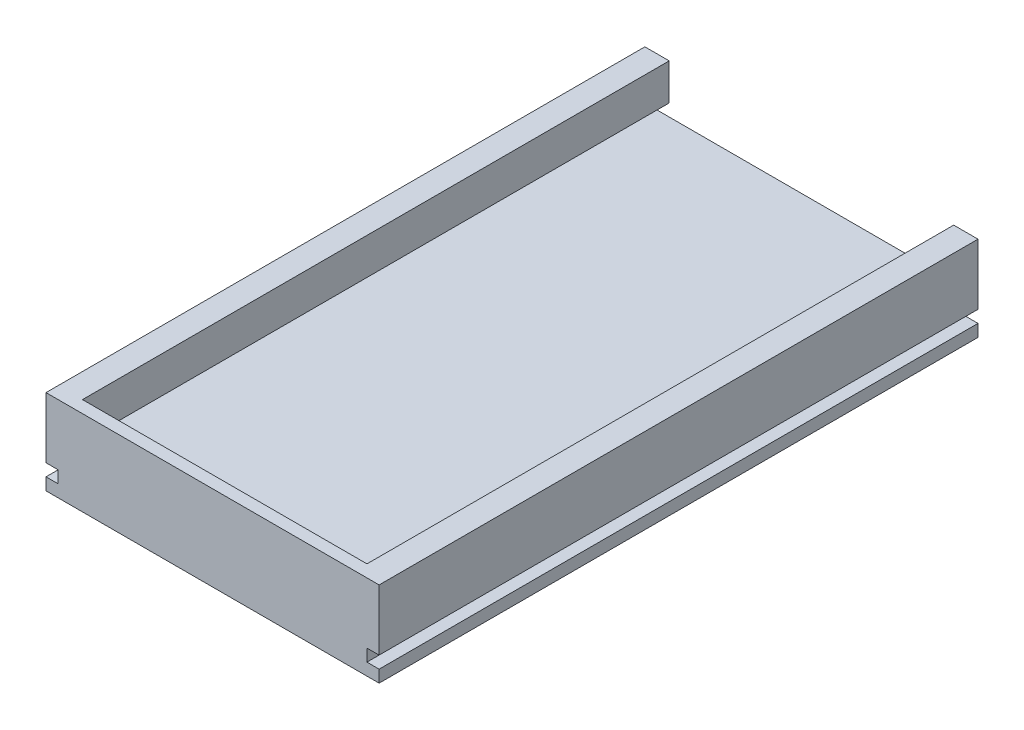
ISO-10303-21;
HEADER;
FILE_DESCRIPTION(('STEP AP214'),'2;1');
FILE_NAME('part.step','',(''),(''),'','','');
FILE_SCHEMA(('AUTOMOTIVE_DESIGN { 1 0 10303 214 1 1 1 1 }'));
ENDSEC;
DATA;
#1=APPLICATION_CONTEXT('core data for automotive mechanical design processes');
#2=APPLICATION_PROTOCOL_DEFINITION('international standard','automotive_design',2000,#1);
#3=PRODUCT_CONTEXT('',#1,'mechanical');
#4=PRODUCT('Part','Part','',(#3));
#5=PRODUCT_RELATED_PRODUCT_CATEGORY('part','',(#4));
#6=PRODUCT_DEFINITION_FORMATION('','',#4);
#7=PRODUCT_DEFINITION_CONTEXT('part definition',#1,'design');
#8=PRODUCT_DEFINITION('design','',#6,#7);
#9=PRODUCT_DEFINITION_SHAPE('','',#8);
#10=(LENGTH_UNIT() NAMED_UNIT(*) SI_UNIT(.MILLI.,.METRE.));
#11=(NAMED_UNIT(*) PLANE_ANGLE_UNIT() SI_UNIT($,.RADIAN.));
#12=(NAMED_UNIT(*) SI_UNIT($,.STERADIAN.) SOLID_ANGLE_UNIT());
#13=UNCERTAINTY_MEASURE_WITH_UNIT(LENGTH_MEASURE(1.E-05),#10,'distance_accuracy_value','');
#14=(GEOMETRIC_REPRESENTATION_CONTEXT(3) GLOBAL_UNCERTAINTY_ASSIGNED_CONTEXT((#13)) GLOBAL_UNIT_ASSIGNED_CONTEXT((#10,
#11,#12)) REPRESENTATION_CONTEXT('',''));
#15=CARTESIAN_POINT('',(0.,0.,0.));
#16=DIRECTION('',(0.,0.,1.));
#17=DIRECTION('',(1.,0.,0.));
#18=AXIS2_PLACEMENT_3D('',#15,#16,#17);
#19=CARTESIAN_POINT('',(0.,3.,0.));
#20=DIRECTION('',(0.,1.,0.));
#21=DIRECTION('',(0.,0.,1.));
#22=AXIS2_PLACEMENT_3D('',#19,#20,#21);
#23=PLANE('',#22);
#24=DIRECTION('',(1.,0.,0.));
#25=VECTOR('',#24,1.);
#26=CARTESIAN_POINT('',(0.,3.,23.63));
#27=LINE('',#26,#25);
#28=CARTESIAN_POINT('',(-12.7,3.,23.63));
#29=VERTEX_POINT('',#28);
#30=CARTESIAN_POINT('',(12.7,3.,23.63));
#31=VERTEX_POINT('',#30);
#32=EDGE_CURVE('E218',#29,#31,#27,.T.);
#33=ORIENTED_EDGE('',*,*,#32,.T.);
#34=DIRECTION('',(0.,0.,1.));
#35=VECTOR('',#34,1.);
#36=CARTESIAN_POINT('',(12.7,3.,-24.63));
#37=LINE('',#36,#35);
#38=CARTESIAN_POINT('',(12.7,3.,-24.63));
#39=VERTEX_POINT('',#38);
#40=EDGE_CURVE('E52',#39,#31,#37,.T.);
#41=ORIENTED_EDGE('',*,*,#40,.F.);
#42=DIRECTION('',(-1.,0.,0.));
#43=VECTOR('',#42,1.);
#44=CARTESIAN_POINT('',(-13.7,3.,-24.63));
#45=LINE('',#44,#43);
#46=CARTESIAN_POINT('',(-12.7,3.,-24.63));
#47=VERTEX_POINT('',#46);
#48=EDGE_CURVE('E38',#39,#47,#45,.T.);
#49=ORIENTED_EDGE('',*,*,#48,.T.);
#50=DIRECTION('',(0.,0.,1.));
#51=VECTOR('',#50,1.);
#52=CARTESIAN_POINT('',(-12.7,3.,-24.63));
#53=LINE('',#52,#51);
#54=EDGE_CURVE('E262',#47,#29,#53,.T.);
#55=ORIENTED_EDGE('',*,*,#54,.T.);
#56=EDGE_LOOP('',(#33,#41,#49,#55));
#57=FACE_BOUND('',#56,.T.);
#58=ADVANCED_FACE('F34',(#57),#23,.T.);
#59=CARTESIAN_POINT('',(-13.7,3.,-24.63));
#60=DIRECTION('',(0.,0.,1.));
#61=DIRECTION('',(1.,0.,0.));
#62=AXIS2_PLACEMENT_3D('',#59,#60,#61);
#63=PLANE('',#62);
#64=DIRECTION('',(1.,0.,0.));
#65=VECTOR('',#64,1.);
#66=CARTESIAN_POINT('',(0.,1.,-24.63));
#67=LINE('',#66,#65);
#68=CARTESIAN_POINT('',(-13.7,1.,-24.63));
#69=VERTEX_POINT('',#68);
#70=CARTESIAN_POINT('',(-12.7,1.,-24.63));
#71=VERTEX_POINT('',#70);
#72=EDGE_CURVE('E328',#69,#71,#67,.T.);
#73=ORIENTED_EDGE('',*,*,#72,.T.);
#74=DIRECTION('',(0.,-1.,0.));
#75=VECTOR('',#74,1.);
#76=CARTESIAN_POINT('',(-12.7,0.,-24.63));
#77=LINE('',#76,#75);
#78=CARTESIAN_POINT('',(-12.7,2.,-24.63));
#79=VERTEX_POINT('',#78);
#80=EDGE_CURVE('E317',#79,#71,#77,.T.);
#81=ORIENTED_EDGE('',*,*,#80,.F.);
#82=DIRECTION('',(1.,0.,0.));
#83=VECTOR('',#82,1.);
#84=CARTESIAN_POINT('',(0.,2.,-24.63));
#85=LINE('',#84,#83);
#86=CARTESIAN_POINT('',(-13.7,2.,-24.63));
#87=VERTEX_POINT('',#86);
#88=EDGE_CURVE('E265',#87,#79,#85,.T.);
#89=ORIENTED_EDGE('',*,*,#88,.F.);
#90=DIRECTION('',(0.,-1.,0.));
#91=VECTOR('',#90,1.);
#92=CARTESIAN_POINT('',(-13.7,3.,-24.63));
#93=LINE('',#92,#91);
#94=CARTESIAN_POINT('',(-13.7,7.,-24.63));
#95=VERTEX_POINT('',#94);
#96=EDGE_CURVE('E294',#95,#87,#93,.T.);
#97=ORIENTED_EDGE('',*,*,#96,.F.);
#98=DIRECTION('',(-1.,0.,0.));
#99=VECTOR('',#98,1.);
#100=CARTESIAN_POINT('',(-13.7,7.,-24.63));
#101=LINE('',#100,#99);
#102=CARTESIAN_POINT('',(-11.7,7.,-24.63));
#103=VERTEX_POINT('',#102);
#104=EDGE_CURVE('E202',#103,#95,#101,.T.);
#105=ORIENTED_EDGE('',*,*,#104,.F.);
#106=DIRECTION('',(0.,-1.,0.));
#107=VECTOR('',#106,1.);
#108=CARTESIAN_POINT('',(-11.7,0.,-24.63));
#109=LINE('',#108,#107);
#110=CARTESIAN_POINT('',(-11.7,4.,-24.63));
#111=VERTEX_POINT('',#110);
#112=EDGE_CURVE('E254',#103,#111,#109,.T.);
#113=ORIENTED_EDGE('',*,*,#112,.T.);
#114=DIRECTION('',(-1.,0.,0.));
#115=VECTOR('',#114,1.);
#116=CARTESIAN_POINT('',(0.,4.,-24.63));
#117=LINE('',#116,#115);
#118=CARTESIAN_POINT('',(-12.7,4.,-24.63));
#119=VERTEX_POINT('',#118);
#120=EDGE_CURVE('E252',#111,#119,#117,.T.);
#121=ORIENTED_EDGE('',*,*,#120,.T.);
#122=DIRECTION('',(0.,-1.,0.));
#123=VECTOR('',#122,1.);
#124=CARTESIAN_POINT('',(-12.7,0.,-24.63));
#125=LINE('',#124,#123);
#126=EDGE_CURVE('E246',#119,#47,#125,.T.);
#127=ORIENTED_EDGE('',*,*,#126,.T.);
#128=ORIENTED_EDGE('',*,*,#48,.F.);
#129=DIRECTION('',(0.,-1.,0.));
#130=VECTOR('',#129,1.);
#131=CARTESIAN_POINT('',(12.7,0.,-24.63));
#132=LINE('',#131,#130);
#133=CARTESIAN_POINT('',(12.7,4.00000000000003,-24.63));
#134=VERTEX_POINT('',#133);
#135=EDGE_CURVE('E241',#134,#39,#132,.T.);
#136=ORIENTED_EDGE('',*,*,#135,.F.);
#137=DIRECTION('',(1.,0.,0.));
#138=VECTOR('',#137,1.);
#139=CARTESIAN_POINT('',(0.,4.,-24.63));
#140=LINE('',#139,#138);
#141=CARTESIAN_POINT('',(11.7,4.00000000000003,-24.63));
#142=VERTEX_POINT('',#141);
#143=EDGE_CURVE('E238',#142,#134,#140,.T.);
#144=ORIENTED_EDGE('',*,*,#143,.F.);
#145=DIRECTION('',(0.,-1.,0.));
#146=VECTOR('',#145,1.);
#147=CARTESIAN_POINT('',(11.7,0.,-24.63));
#148=LINE('',#147,#146);
#149=CARTESIAN_POINT('',(11.7,7.,-24.63));
#150=VERTEX_POINT('',#149);
#151=EDGE_CURVE('E235',#150,#142,#148,.T.);
#152=ORIENTED_EDGE('',*,*,#151,.F.);
#153=DIRECTION('',(-1.,0.,0.));
#154=VECTOR('',#153,1.);
#155=CARTESIAN_POINT('',(11.7,7.,-24.63));
#156=LINE('',#155,#154);
#157=CARTESIAN_POINT('',(13.7,7.,-24.63));
#158=VERTEX_POINT('',#157);
#159=EDGE_CURVE('E206',#158,#150,#156,.T.);
#160=ORIENTED_EDGE('',*,*,#159,.F.);
#161=DIRECTION('',(0.,-1.,0.));
#162=VECTOR('',#161,1.);
#163=CARTESIAN_POINT('',(13.7,3.,-24.63));
#164=LINE('',#163,#162);
#165=CARTESIAN_POINT('',(13.7,2.,-24.63));
#166=VERTEX_POINT('',#165);
#167=EDGE_CURVE('E297',#158,#166,#164,.T.);
#168=ORIENTED_EDGE('',*,*,#167,.T.);
#169=DIRECTION('',(-1.,0.,0.));
#170=VECTOR('',#169,1.);
#171=CARTESIAN_POINT('',(0.,2.,-24.63));
#172=LINE('',#171,#170);
#173=CARTESIAN_POINT('',(12.7,2.,-24.63));
#174=VERTEX_POINT('',#173);
#175=EDGE_CURVE('E331',#166,#174,#172,.T.);
#176=ORIENTED_EDGE('',*,*,#175,.T.);
#177=DIRECTION('',(0.,-1.,0.));
#178=VECTOR('',#177,1.);
#179=CARTESIAN_POINT('',(12.7,0.,-24.63));
#180=LINE('',#179,#178);
#181=CARTESIAN_POINT('',(12.7,1.,-24.63));
#182=VERTEX_POINT('',#181);
#183=EDGE_CURVE('E322',#174,#182,#180,.T.);
#184=ORIENTED_EDGE('',*,*,#183,.T.);
#185=DIRECTION('',(-1.,0.,0.));
#186=VECTOR('',#185,1.);
#187=CARTESIAN_POINT('',(0.,1.,-24.63));
#188=LINE('',#187,#186);
#189=CARTESIAN_POINT('',(13.7,1.,-24.63));
#190=VERTEX_POINT('',#189);
#191=EDGE_CURVE('E334',#190,#182,#188,.T.);
#192=ORIENTED_EDGE('',*,*,#191,.F.);
#193=CARTESIAN_POINT('',(13.7,0.,-24.63));
#194=VERTEX_POINT('',#193);
#195=EDGE_CURVE('E296',#190,#194,#164,.T.);
#196=ORIENTED_EDGE('',*,*,#195,.T.);
#197=DIRECTION('',(-1.,0.,0.));
#198=VECTOR('',#197,1.);
#199=CARTESIAN_POINT('',(-13.7,0.,-24.63));
#200=LINE('',#199,#198);
#201=CARTESIAN_POINT('',(-13.7,0.,-24.63));
#202=VERTEX_POINT('',#201);
#203=EDGE_CURVE('E290',#194,#202,#200,.T.);
#204=ORIENTED_EDGE('',*,*,#203,.T.);
#205=EDGE_CURVE('E184',#69,#202,#93,.T.);
#206=ORIENTED_EDGE('',*,*,#205,.F.);
#207=EDGE_LOOP('',(#73,#81,#89,#97,#105,#113,#121,#127,#128,#136,#144,#152,#160,#168,#176,#184,
#192,#196,#204,#206));
#208=FACE_BOUND('',#207,.T.);
#209=ADVANCED_FACE('F273',(#208),#63,.F.);
#210=CARTESIAN_POINT('',(-13.7,3.,-24.63));
#211=DIRECTION('',(1.,0.,0.));
#212=DIRECTION('',(0.,0.,-1.));
#213=AXIS2_PLACEMENT_3D('',#210,#211,#212);
#214=PLANE('',#213);
#215=DIRECTION('',(0.,0.,-1.));
#216=VECTOR('',#215,1.);
#217=CARTESIAN_POINT('',(-13.7,1.,31.37));
#218=LINE('',#217,#216);
#219=CARTESIAN_POINT('',(-13.7,1.,24.63));
#220=VERTEX_POINT('',#219);
#221=EDGE_CURVE('E319',#220,#69,#218,.T.);
#222=ORIENTED_EDGE('',*,*,#221,.T.);
#223=ORIENTED_EDGE('',*,*,#205,.T.);
#224=DIRECTION('',(0.,0.,1.));
#225=VECTOR('',#224,1.);
#226=CARTESIAN_POINT('',(-13.7,0.,-24.63));
#227=LINE('',#226,#225);
#228=CARTESIAN_POINT('',(-13.7,0.,24.63));
#229=VERTEX_POINT('',#228);
#230=EDGE_CURVE('E284',#202,#229,#227,.T.);
#231=ORIENTED_EDGE('',*,*,#230,.T.);
#232=DIRECTION('',(0.,-1.,0.));
#233=VECTOR('',#232,1.);
#234=CARTESIAN_POINT('',(-13.7,3.,24.63));
#235=LINE('',#234,#233);
#236=EDGE_CURVE('E185',#220,#229,#235,.T.);
#237=ORIENTED_EDGE('',*,*,#236,.F.);
#238=EDGE_LOOP('',(#222,#223,#231,#237));
#239=FACE_BOUND('',#238,.T.);
#240=ADVANCED_FACE('F358',(#239),#214,.F.);
#241=CARTESIAN_POINT('',(-13.7,3.,24.63));
#242=DIRECTION('',(0.,0.,-1.));
#243=DIRECTION('',(-1.,0.,0.));
#244=AXIS2_PLACEMENT_3D('',#241,#242,#243);
#245=PLANE('',#244);
#246=DIRECTION('',(0.,-1.,0.));
#247=VECTOR('',#246,1.);
#248=CARTESIAN_POINT('',(13.7,3.,24.63));
#249=LINE('',#248,#247);
#250=CARTESIAN_POINT('',(13.7,7.,24.63));
#251=VERTEX_POINT('',#250);
#252=CARTESIAN_POINT('',(13.7,2.,24.63));
#253=VERTEX_POINT('',#252);
#254=EDGE_CURVE('E192',#251,#253,#249,.T.);
#255=ORIENTED_EDGE('',*,*,#254,.F.);
#256=DIRECTION('',(1.,0.,0.));
#257=VECTOR('',#256,1.);
#258=CARTESIAN_POINT('',(13.7,7.,24.63));
#259=LINE('',#258,#257);
#260=CARTESIAN_POINT('',(-13.7,7.,24.63));
#261=VERTEX_POINT('',#260);
#262=EDGE_CURVE('E188',#261,#251,#259,.T.);
#263=ORIENTED_EDGE('',*,*,#262,.F.);
#264=CARTESIAN_POINT('',(-13.7,2.,24.63));
#265=VERTEX_POINT('',#264);
#266=EDGE_CURVE('E175',#261,#265,#235,.T.);
#267=ORIENTED_EDGE('',*,*,#266,.T.);
#268=DIRECTION('',(1.,0.,0.));
#269=VECTOR('',#268,1.);
#270=CARTESIAN_POINT('',(-13.7,2.,24.63));
#271=LINE('',#270,#269);
#272=CARTESIAN_POINT('',(-12.7,2.,24.63));
#273=VERTEX_POINT('',#272);
#274=EDGE_CURVE('E307',#265,#273,#271,.T.);
#275=ORIENTED_EDGE('',*,*,#274,.T.);
#276=DIRECTION('',(0.,-1.,0.));
#277=VECTOR('',#276,1.);
#278=CARTESIAN_POINT('',(-12.7,3.,24.63));
#279=LINE('',#278,#277);
#280=CARTESIAN_POINT('',(-12.7,1.,24.63));
#281=VERTEX_POINT('',#280);
#282=EDGE_CURVE('E44',#273,#281,#279,.T.);
#283=ORIENTED_EDGE('',*,*,#282,.T.);
#284=DIRECTION('',(1.,0.,0.));
#285=VECTOR('',#284,1.);
#286=CARTESIAN_POINT('',(-13.7,1.,24.63));
#287=LINE('',#286,#285);
#288=EDGE_CURVE('E11',#220,#281,#287,.T.);
#289=ORIENTED_EDGE('',*,*,#288,.F.);
#290=ORIENTED_EDGE('',*,*,#236,.T.);
#291=DIRECTION('',(1.,0.,0.));
#292=VECTOR('',#291,1.);
#293=CARTESIAN_POINT('',(-13.7,0.,24.63));
#294=LINE('',#293,#292);
#295=CARTESIAN_POINT('',(13.7,0.,24.63));
#296=VERTEX_POINT('',#295);
#297=EDGE_CURVE('E281',#229,#296,#294,.T.);
#298=ORIENTED_EDGE('',*,*,#297,.T.);
#299=CARTESIAN_POINT('',(13.7,1.,24.63));
#300=VERTEX_POINT('',#299);
#301=EDGE_CURVE('E280',#300,#296,#249,.T.);
#302=ORIENTED_EDGE('',*,*,#301,.F.);
#303=DIRECTION('',(-1.,0.,0.));
#304=VECTOR('',#303,1.);
#305=CARTESIAN_POINT('',(-13.7,1.,24.63));
#306=LINE('',#305,#304);
#307=CARTESIAN_POINT('',(12.7,1.,24.63));
#308=VERTEX_POINT('',#307);
#309=EDGE_CURVE('E304',#300,#308,#306,.T.);
#310=ORIENTED_EDGE('',*,*,#309,.T.);
#311=DIRECTION('',(0.,-1.,0.));
#312=VECTOR('',#311,1.);
#313=CARTESIAN_POINT('',(12.7,3.,24.63));
#314=LINE('',#313,#312);
#315=CARTESIAN_POINT('',(12.7,2.,24.63));
#316=VERTEX_POINT('',#315);
#317=EDGE_CURVE('E302',#316,#308,#314,.T.);
#318=ORIENTED_EDGE('',*,*,#317,.F.);
#319=DIRECTION('',(-1.,0.,0.));
#320=VECTOR('',#319,1.);
#321=CARTESIAN_POINT('',(-13.7,2.,24.63));
#322=LINE('',#321,#320);
#323=EDGE_CURVE('E300',#253,#316,#322,.T.);
#324=ORIENTED_EDGE('',*,*,#323,.F.);
#325=EDGE_LOOP('',(#255,#263,#267,#275,#283,#289,#290,#298,#302,#310,#318,#324));
#326=FACE_BOUND('',#325,.T.);
#327=ADVANCED_FACE('F189',(#326),#245,.F.);
#328=CARTESIAN_POINT('',(13.7,3.,-24.63));
#329=DIRECTION('',(-1.,0.,0.));
#330=DIRECTION('',(0.,0.,1.));
#331=AXIS2_PLACEMENT_3D('',#328,#329,#330);
#332=PLANE('',#331);
#333=DIRECTION('',(0.,0.,-1.));
#334=VECTOR('',#333,1.);
#335=CARTESIAN_POINT('',(13.7,2.,31.37));
#336=LINE('',#335,#334);
#337=EDGE_CURVE('E343',#253,#166,#336,.T.);
#338=ORIENTED_EDGE('',*,*,#337,.T.);
#339=ORIENTED_EDGE('',*,*,#167,.F.);
#340=DIRECTION('',(0.,0.,-1.));
#341=VECTOR('',#340,1.);
#342=CARTESIAN_POINT('',(13.7,7.,-24.63));
#343=LINE('',#342,#341);
#344=EDGE_CURVE('E196',#251,#158,#343,.T.);
#345=ORIENTED_EDGE('',*,*,#344,.F.);
#346=ORIENTED_EDGE('',*,*,#254,.T.);
#347=EDGE_LOOP('',(#338,#339,#345,#346));
#348=FACE_BOUND('',#347,.T.);
#349=ADVANCED_FACE('F384',(#348),#332,.F.);
#350=ORIENTED_EDGE('',*,*,#195,.F.);
#351=DIRECTION('',(0.,0.,-1.));
#352=VECTOR('',#351,1.);
#353=CARTESIAN_POINT('',(13.7,1.,31.37));
#354=LINE('',#353,#352);
#355=EDGE_CURVE('E341',#300,#190,#354,.T.);
#356=ORIENTED_EDGE('',*,*,#355,.F.);
#357=ORIENTED_EDGE('',*,*,#301,.T.);
#358=DIRECTION('',(0.,0.,-1.));
#359=VECTOR('',#358,1.);
#360=CARTESIAN_POINT('',(13.7,0.,-24.63));
#361=LINE('',#360,#359);
#362=EDGE_CURVE('E340',#296,#194,#361,.T.);
#363=ORIENTED_EDGE('',*,*,#362,.T.);
#364=EDGE_LOOP('',(#350,#356,#357,#363));
#365=FACE_BOUND('',#364,.T.);
#366=ADVANCED_FACE('F36',(#365),#332,.F.);
#367=ORIENTED_EDGE('',*,*,#96,.T.);
#368=DIRECTION('',(0.,0.,-1.));
#369=VECTOR('',#368,1.);
#370=CARTESIAN_POINT('',(-13.7,2.,31.37));
#371=LINE('',#370,#369);
#372=EDGE_CURVE('E181',#265,#87,#371,.T.);
#373=ORIENTED_EDGE('',*,*,#372,.F.);
#374=ORIENTED_EDGE('',*,*,#266,.F.);
#375=DIRECTION('',(0.,0.,1.));
#376=VECTOR('',#375,1.);
#377=CARTESIAN_POINT('',(-13.7,7.,24.63));
#378=LINE('',#377,#376);
#379=EDGE_CURVE('E180',#95,#261,#378,.T.);
#380=ORIENTED_EDGE('',*,*,#379,.F.);
#381=EDGE_LOOP('',(#367,#373,#374,#380));
#382=FACE_BOUND('',#381,.T.);
#383=ADVANCED_FACE('F178',(#382),#214,.F.);
#384=CARTESIAN_POINT('',(0.,0.,0.));
#385=DIRECTION('',(0.,1.,0.));
#386=DIRECTION('',(0.,0.,1.));
#387=AXIS2_PLACEMENT_3D('',#384,#385,#386);
#388=PLANE('',#387);
#389=ORIENTED_EDGE('',*,*,#362,.F.);
#390=ORIENTED_EDGE('',*,*,#297,.F.);
#391=ORIENTED_EDGE('',*,*,#230,.F.);
#392=ORIENTED_EDGE('',*,*,#203,.F.);
#393=EDGE_LOOP('',(#389,#390,#391,#392));
#394=FACE_BOUND('',#393,.T.);
#395=ADVANCED_FACE('F356',(#394),#388,.F.);
#396=CARTESIAN_POINT('',(12.7,0.,31.37));
#397=DIRECTION('',(1.,0.,0.));
#398=DIRECTION('',(0.,0.,-1.));
#399=AXIS2_PLACEMENT_3D('',#396,#397,#398);
#400=PLANE('',#399);
#401=ORIENTED_EDGE('',*,*,#317,.T.);
#402=DIRECTION('',(0.,0.,-1.));
#403=VECTOR('',#402,1.);
#404=CARTESIAN_POINT('',(12.7,1.,31.37));
#405=LINE('',#404,#403);
#406=EDGE_CURVE('E338',#308,#182,#405,.T.);
#407=ORIENTED_EDGE('',*,*,#406,.T.);
#408=ORIENTED_EDGE('',*,*,#183,.F.);
#409=DIRECTION('',(0.,0.,-1.));
#410=VECTOR('',#409,1.);
#411=CARTESIAN_POINT('',(12.7,2.,31.37));
#412=LINE('',#411,#410);
#413=EDGE_CURVE('E337',#316,#174,#412,.T.);
#414=ORIENTED_EDGE('',*,*,#413,.F.);
#415=EDGE_LOOP('',(#401,#407,#408,#414));
#416=FACE_BOUND('',#415,.T.);
#417=ADVANCED_FACE('F391',(#416),#400,.T.);
#418=CARTESIAN_POINT('',(0.,1.,31.37));
#419=DIRECTION('',(0.,-1.,0.));
#420=DIRECTION('',(0.,0.,-1.));
#421=AXIS2_PLACEMENT_3D('',#418,#419,#420);
#422=PLANE('',#421);
#423=ORIENTED_EDGE('',*,*,#355,.T.);
#424=ORIENTED_EDGE('',*,*,#191,.T.);
#425=ORIENTED_EDGE('',*,*,#406,.F.);
#426=ORIENTED_EDGE('',*,*,#309,.F.);
#427=EDGE_LOOP('',(#423,#424,#425,#426));
#428=FACE_BOUND('',#427,.T.);
#429=ADVANCED_FACE('F394',(#428),#422,.F.);
#430=CARTESIAN_POINT('',(0.,2.,31.37));
#431=DIRECTION('',(0.,-1.,0.));
#432=DIRECTION('',(0.,0.,-1.));
#433=AXIS2_PLACEMENT_3D('',#430,#431,#432);
#434=PLANE('',#433);
#435=ORIENTED_EDGE('',*,*,#323,.T.);
#436=ORIENTED_EDGE('',*,*,#413,.T.);
#437=ORIENTED_EDGE('',*,*,#175,.F.);
#438=ORIENTED_EDGE('',*,*,#337,.F.);
#439=EDGE_LOOP('',(#435,#436,#437,#438));
#440=FACE_BOUND('',#439,.T.);
#441=ADVANCED_FACE('F386',(#440),#434,.T.);
#442=CARTESIAN_POINT('',(0.,1.,31.37));
#443=DIRECTION('',(0.,1.,0.));
#444=DIRECTION('',(0.,0.,1.));
#445=AXIS2_PLACEMENT_3D('',#442,#443,#444);
#446=PLANE('',#445);
#447=ORIENTED_EDGE('',*,*,#288,.T.);
#448=DIRECTION('',(0.,0.,-1.));
#449=VECTOR('',#448,1.);
#450=CARTESIAN_POINT('',(-12.7,1.,31.37));
#451=LINE('',#450,#449);
#452=EDGE_CURVE('E315',#281,#71,#451,.T.);
#453=ORIENTED_EDGE('',*,*,#452,.T.);
#454=ORIENTED_EDGE('',*,*,#72,.F.);
#455=ORIENTED_EDGE('',*,*,#221,.F.);
#456=EDGE_LOOP('',(#447,#453,#454,#455));
#457=FACE_BOUND('',#456,.T.);
#458=ADVANCED_FACE('F359',(#457),#446,.T.);
#459=CARTESIAN_POINT('',(-12.7,0.,31.37));
#460=DIRECTION('',(1.,0.,0.));
#461=DIRECTION('',(0.,0.,-1.));
#462=AXIS2_PLACEMENT_3D('',#459,#460,#461);
#463=PLANE('',#462);
#464=DIRECTION('',(0.,0.,-1.));
#465=VECTOR('',#464,1.);
#466=CARTESIAN_POINT('',(-12.7,2.,31.37));
#467=LINE('',#466,#465);
#468=EDGE_CURVE('E60',#273,#79,#467,.T.);
#469=ORIENTED_EDGE('',*,*,#468,.T.);
#470=ORIENTED_EDGE('',*,*,#80,.T.);
#471=ORIENTED_EDGE('',*,*,#452,.F.);
#472=ORIENTED_EDGE('',*,*,#282,.F.);
#473=EDGE_LOOP('',(#469,#470,#471,#472));
#474=FACE_BOUND('',#473,.T.);
#475=ADVANCED_FACE('F313',(#474),#463,.F.);
#476=CARTESIAN_POINT('',(0.,2.,31.37));
#477=DIRECTION('',(0.,1.,0.));
#478=DIRECTION('',(0.,0.,1.));
#479=AXIS2_PLACEMENT_3D('',#476,#477,#478);
#480=PLANE('',#479);
#481=ORIENTED_EDGE('',*,*,#372,.T.);
#482=ORIENTED_EDGE('',*,*,#88,.T.);
#483=ORIENTED_EDGE('',*,*,#468,.F.);
#484=ORIENTED_EDGE('',*,*,#274,.F.);
#485=EDGE_LOOP('',(#481,#482,#483,#484));
#486=FACE_BOUND('',#485,.T.);
#487=ADVANCED_FACE('F496',(#486),#480,.F.);
#488=CARTESIAN_POINT('',(-12.7,0.,-24.63));
#489=DIRECTION('',(-1.,0.,0.));
#490=DIRECTION('',(0.,0.,1.));
#491=AXIS2_PLACEMENT_3D('',#488,#489,#490);
#492=PLANE('',#491);
#493=DIRECTION('',(0.,0.,1.));
#494=VECTOR('',#493,1.);
#495=CARTESIAN_POINT('',(-12.7,4.,-24.63));
#496=LINE('',#495,#494);
#497=CARTESIAN_POINT('',(-12.7,4.,23.63));
#498=VERTEX_POINT('',#497);
#499=EDGE_CURVE('E256',#119,#498,#496,.T.);
#500=ORIENTED_EDGE('',*,*,#499,.T.);
#501=DIRECTION('',(0.,-1.,0.));
#502=VECTOR('',#501,1.);
#503=CARTESIAN_POINT('',(-12.7,5.,23.63));
#504=LINE('',#503,#502);
#505=EDGE_CURVE('E222',#498,#29,#504,.T.);
#506=ORIENTED_EDGE('',*,*,#505,.T.);
#507=ORIENTED_EDGE('',*,*,#54,.F.);
#508=ORIENTED_EDGE('',*,*,#126,.F.);
#509=EDGE_LOOP('',(#500,#506,#507,#508));
#510=FACE_BOUND('',#509,.T.);
#511=ADVANCED_FACE('F279',(#510),#492,.F.);
#512=CARTESIAN_POINT('',(-11.7,0.,-24.63));
#513=DIRECTION('',(-1.,0.,0.));
#514=DIRECTION('',(0.,0.,1.));
#515=AXIS2_PLACEMENT_3D('',#512,#513,#514);
#516=PLANE('',#515);
#517=ORIENTED_EDGE('',*,*,#112,.F.);
#518=DIRECTION('',(0.,0.,-1.));
#519=VECTOR('',#518,1.);
#520=CARTESIAN_POINT('',(-11.7,7.,-24.63));
#521=LINE('',#520,#519);
#522=CARTESIAN_POINT('',(-11.7,7.,23.63));
#523=VERTEX_POINT('',#522);
#524=EDGE_CURVE('E215',#523,#103,#521,.T.);
#525=ORIENTED_EDGE('',*,*,#524,.F.);
#526=DIRECTION('',(0.,-1.,0.));
#527=VECTOR('',#526,1.);
#528=CARTESIAN_POINT('',(-11.7,0.,23.63));
#529=LINE('',#528,#527);
#530=CARTESIAN_POINT('',(-11.7,4.,23.63));
#531=VERTEX_POINT('',#530);
#532=EDGE_CURVE('E232',#523,#531,#529,.T.);
#533=ORIENTED_EDGE('',*,*,#532,.T.);
#534=DIRECTION('',(0.,0.,1.));
#535=VECTOR('',#534,1.);
#536=CARTESIAN_POINT('',(-11.7,4.,-24.63));
#537=LINE('',#536,#535);
#538=EDGE_CURVE('E259',#111,#531,#537,.T.);
#539=ORIENTED_EDGE('',*,*,#538,.F.);
#540=EDGE_LOOP('',(#517,#525,#533,#539));
#541=FACE_BOUND('',#540,.T.);
#542=ADVANCED_FACE('F367',(#541),#516,.F.);
#543=CARTESIAN_POINT('',(0.,4.,-24.63));
#544=DIRECTION('',(0.,1.,0.));
#545=DIRECTION('',(0.,0.,1.));
#546=AXIS2_PLACEMENT_3D('',#543,#544,#545);
#547=PLANE('',#546);
#548=ORIENTED_EDGE('',*,*,#538,.T.);
#549=DIRECTION('',(-1.,0.,0.));
#550=VECTOR('',#549,1.);
#551=CARTESIAN_POINT('',(0.,4.,23.63));
#552=LINE('',#551,#550);
#553=EDGE_CURVE('E229',#531,#498,#552,.T.);
#554=ORIENTED_EDGE('',*,*,#553,.T.);
#555=ORIENTED_EDGE('',*,*,#499,.F.);
#556=ORIENTED_EDGE('',*,*,#120,.F.);
#557=EDGE_LOOP('',(#548,#554,#555,#556));
#558=FACE_BOUND('',#557,.T.);
#559=ADVANCED_FACE('F365',(#558),#547,.F.);
#560=CARTESIAN_POINT('',(12.7,0.,-24.63));
#561=DIRECTION('',(-1.,0.,0.));
#562=DIRECTION('',(0.,-1.,0.));
#563=AXIS2_PLACEMENT_3D('',#560,#561,#562);
#564=PLANE('',#563);
#565=DIRECTION('',(0.,-1.,0.));
#566=VECTOR('',#565,1.);
#567=CARTESIAN_POINT('',(12.7,5.,23.63));
#568=LINE('',#567,#566);
#569=CARTESIAN_POINT('',(12.7,4.00000000000003,23.63));
#570=VERTEX_POINT('',#569);
#571=EDGE_CURVE('E220',#570,#31,#568,.T.);
#572=ORIENTED_EDGE('',*,*,#571,.F.);
#573=DIRECTION('',(0.,0.,1.));
#574=VECTOR('',#573,1.);
#575=CARTESIAN_POINT('',(12.7,4.00000000000003,-24.63));
#576=LINE('',#575,#574);
#577=EDGE_CURVE('E247',#134,#570,#576,.T.);
#578=ORIENTED_EDGE('',*,*,#577,.F.);
#579=ORIENTED_EDGE('',*,*,#135,.T.);
#580=ORIENTED_EDGE('',*,*,#40,.T.);
#581=EDGE_LOOP('',(#572,#578,#579,#580));
#582=FACE_BOUND('',#581,.T.);
#583=ADVANCED_FACE('F382',(#582),#564,.T.);
#584=CARTESIAN_POINT('',(0.,4.,-24.63));
#585=DIRECTION('',(0.,-1.,0.));
#586=DIRECTION('',(1.,0.,0.));
#587=AXIS2_PLACEMENT_3D('',#584,#585,#586);
#588=PLANE('',#587);
#589=DIRECTION('',(1.,0.,0.));
#590=VECTOR('',#589,1.);
#591=CARTESIAN_POINT('',(0.,4.,23.63));
#592=LINE('',#591,#590);
#593=CARTESIAN_POINT('',(11.7,4.00000000000003,23.63));
#594=VERTEX_POINT('',#593);
#595=EDGE_CURVE('E227',#594,#570,#592,.T.);
#596=ORIENTED_EDGE('',*,*,#595,.F.);
#597=DIRECTION('',(0.,0.,1.));
#598=VECTOR('',#597,1.);
#599=CARTESIAN_POINT('',(11.7,4.00000000000003,-24.63));
#600=LINE('',#599,#598);
#601=EDGE_CURVE('E244',#142,#594,#600,.T.);
#602=ORIENTED_EDGE('',*,*,#601,.F.);
#603=ORIENTED_EDGE('',*,*,#143,.T.);
#604=ORIENTED_EDGE('',*,*,#577,.T.);
#605=EDGE_LOOP('',(#596,#602,#603,#604));
#606=FACE_BOUND('',#605,.T.);
#607=ADVANCED_FACE('F379',(#606),#588,.T.);
#608=CARTESIAN_POINT('',(11.7,0.,-24.63));
#609=DIRECTION('',(-1.,0.,0.));
#610=DIRECTION('',(0.,-1.,0.));
#611=AXIS2_PLACEMENT_3D('',#608,#609,#610);
#612=PLANE('',#611);
#613=DIRECTION('',(0.,-1.,0.));
#614=VECTOR('',#613,1.);
#615=CARTESIAN_POINT('',(11.7,0.,23.63));
#616=LINE('',#615,#614);
#617=CARTESIAN_POINT('',(11.7,7.,23.63));
#618=VERTEX_POINT('',#617);
#619=EDGE_CURVE('E225',#618,#594,#616,.T.);
#620=ORIENTED_EDGE('',*,*,#619,.F.);
#621=DIRECTION('',(0.,0.,1.));
#622=VECTOR('',#621,1.);
#623=CARTESIAN_POINT('',(11.7,7.,23.63));
#624=LINE('',#623,#622);
#625=EDGE_CURVE('E209',#150,#618,#624,.T.);
#626=ORIENTED_EDGE('',*,*,#625,.F.);
#627=ORIENTED_EDGE('',*,*,#151,.T.);
#628=ORIENTED_EDGE('',*,*,#601,.T.);
#629=EDGE_LOOP('',(#620,#626,#627,#628));
#630=FACE_BOUND('',#629,.T.);
#631=ADVANCED_FACE('F375',(#630),#612,.T.);
#632=CARTESIAN_POINT('',(0.,5.,23.63));
#633=DIRECTION('',(0.,0.,-1.));
#634=DIRECTION('',(-1.,0.,0.));
#635=AXIS2_PLACEMENT_3D('',#632,#633,#634);
#636=PLANE('',#635);
#637=ORIENTED_EDGE('',*,*,#532,.F.);
#638=DIRECTION('',(-1.,0.,0.));
#639=VECTOR('',#638,1.);
#640=CARTESIAN_POINT('',(-11.7,7.,23.63));
#641=LINE('',#640,#639);
#642=EDGE_CURVE('E212',#618,#523,#641,.T.);
#643=ORIENTED_EDGE('',*,*,#642,.F.);
#644=ORIENTED_EDGE('',*,*,#619,.T.);
#645=ORIENTED_EDGE('',*,*,#595,.T.);
#646=ORIENTED_EDGE('',*,*,#571,.T.);
#647=ORIENTED_EDGE('',*,*,#32,.F.);
#648=ORIENTED_EDGE('',*,*,#505,.F.);
#649=ORIENTED_EDGE('',*,*,#553,.F.);
#650=EDGE_LOOP('',(#637,#643,#644,#645,#646,#647,#648,#649));
#651=FACE_BOUND('',#650,.T.);
#652=ADVANCED_FACE('F371',(#651),#636,.T.);
#653=CARTESIAN_POINT('',(0.,7.,0.));
#654=DIRECTION('',(0.,-1.,0.));
#655=DIRECTION('',(0.,0.,-1.));
#656=AXIS2_PLACEMENT_3D('',#653,#654,#655);
#657=PLANE('',#656);
#658=ORIENTED_EDGE('',*,*,#379,.T.);
#659=ORIENTED_EDGE('',*,*,#262,.T.);
#660=ORIENTED_EDGE('',*,*,#344,.T.);
#661=ORIENTED_EDGE('',*,*,#159,.T.);
#662=ORIENTED_EDGE('',*,*,#625,.T.);
#663=ORIENTED_EDGE('',*,*,#642,.T.);
#664=ORIENTED_EDGE('',*,*,#524,.T.);
#665=ORIENTED_EDGE('',*,*,#104,.T.);
#666=EDGE_LOOP('',(#658,#659,#660,#661,#662,#663,#664,#665));
#667=FACE_BOUND('',#666,.T.);
#668=ADVANCED_FACE('F199',(#667),#657,.F.);
#669=CLOSED_SHELL('',(#58,#209,#240,#327,#349,#366,#383,#395,#417,#429,#441,#458,#475,#487,#511,
#542,#559,#583,#607,#631,#652,#668));
#670=MANIFOLD_SOLID_BREP('B2',#669);
#671=ADVANCED_BREP_SHAPE_REPRESENTATION('',(#18,#670),#14);
#672=SHAPE_DEFINITION_REPRESENTATION(#9,#671);
ENDSEC;
END-ISO-10303-21;
